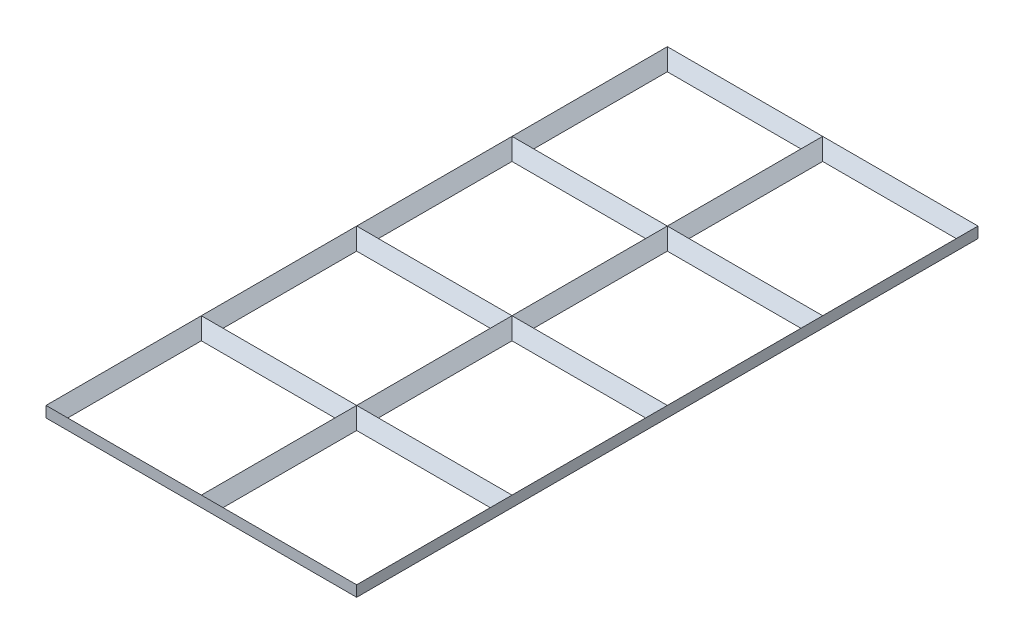
ISO-10303-21;
HEADER;
FILE_DESCRIPTION(('STEP AP214'),'2;1');
FILE_NAME('part.step','',(''),(''),'','','');
FILE_SCHEMA(('AUTOMOTIVE_DESIGN { 1 0 10303 214 1 1 1 1 }'));
ENDSEC;
DATA;
#1=APPLICATION_CONTEXT('core data for automotive mechanical design processes');
#2=APPLICATION_PROTOCOL_DEFINITION('international standard','automotive_design',2000,#1);
#3=PRODUCT_CONTEXT('',#1,'mechanical');
#4=PRODUCT('Part','Part','',(#3));
#5=PRODUCT_RELATED_PRODUCT_CATEGORY('part','',(#4));
#6=PRODUCT_DEFINITION_FORMATION('','',#4);
#7=PRODUCT_DEFINITION_CONTEXT('part definition',#1,'design');
#8=PRODUCT_DEFINITION('design','',#6,#7);
#9=PRODUCT_DEFINITION_SHAPE('','',#8);
#10=(LENGTH_UNIT() NAMED_UNIT(*) SI_UNIT(.MILLI.,.METRE.));
#11=(NAMED_UNIT(*) PLANE_ANGLE_UNIT() SI_UNIT($,.RADIAN.));
#12=(NAMED_UNIT(*) SI_UNIT($,.STERADIAN.) SOLID_ANGLE_UNIT());
#13=UNCERTAINTY_MEASURE_WITH_UNIT(LENGTH_MEASURE(1.E-05),#10,'distance_accuracy_value','');
#14=(GEOMETRIC_REPRESENTATION_CONTEXT(3) GLOBAL_UNCERTAINTY_ASSIGNED_CONTEXT((#13)) GLOBAL_UNIT_ASSIGNED_CONTEXT((#10,
#11,#12)) REPRESENTATION_CONTEXT('',''));
#15=CARTESIAN_POINT('',(0.,0.,0.));
#16=DIRECTION('',(0.,0.,1.));
#17=DIRECTION('',(1.,0.,0.));
#18=AXIS2_PLACEMENT_3D('',#15,#16,#17);
#19=CARTESIAN_POINT('',(0.,3.5,-50.));
#20=DIRECTION('',(0.,0.,-1.));
#21=DIRECTION('',(-1.,0.,0.));
#22=AXIS2_PLACEMENT_3D('',#19,#20,#21);
#23=PLANE('',#22);
#24=DIRECTION('',(1.,0.,0.));
#25=VECTOR('',#24,1.);
#26=CARTESIAN_POINT('',(0.,0.,-50.));
#27=LINE('',#26,#25);
#28=CARTESIAN_POINT('',(0.,0.,-50.));
#29=VERTEX_POINT('',#28);
#30=CARTESIAN_POINT('',(100.,0.,-50.));
#31=VERTEX_POINT('',#30);
#32=EDGE_CURVE('E448',#29,#31,#27,.T.);
#33=ORIENTED_EDGE('',*,*,#32,.F.);
#34=DIRECTION('',(0.,-1.,0.));
#35=VECTOR('',#34,1.);
#36=CARTESIAN_POINT('',(0.,3.5,-50.));
#37=LINE('',#36,#35);
#38=CARTESIAN_POINT('',(0.,3.5,-50.));
#39=VERTEX_POINT('',#38);
#40=EDGE_CURVE('E11',#39,#29,#37,.T.);
#41=ORIENTED_EDGE('',*,*,#40,.F.);
#42=DIRECTION('',(1.,0.,0.));
#43=VECTOR('',#42,1.);
#44=CARTESIAN_POINT('',(0.,3.5,-50.));
#45=LINE('',#44,#43);
#46=CARTESIAN_POINT('',(50.,3.5,-50.));
#47=VERTEX_POINT('',#46);
#48=EDGE_CURVE('E56',#39,#47,#45,.T.);
#49=ORIENTED_EDGE('',*,*,#48,.T.);
#50=DIRECTION('',(1.,0.,0.));
#51=VECTOR('',#50,1.);
#52=CARTESIAN_POINT('',(50.,3.5,-50.));
#53=LINE('',#52,#51);
#54=CARTESIAN_POINT('',(100.,3.5,-50.));
#55=VERTEX_POINT('',#54);
#56=EDGE_CURVE('E328',#47,#55,#53,.T.);
#57=ORIENTED_EDGE('',*,*,#56,.T.);
#58=DIRECTION('',(0.,-1.,0.));
#59=VECTOR('',#58,1.);
#60=CARTESIAN_POINT('',(100.,3.5,-50.));
#61=LINE('',#60,#59);
#62=EDGE_CURVE('E334',#55,#31,#61,.T.);
#63=ORIENTED_EDGE('',*,*,#62,.T.);
#64=EDGE_LOOP('',(#33,#41,#49,#57,#63));
#65=FACE_BOUND('',#64,.T.);
#66=ADVANCED_FACE('F41',(#65),#23,.T.);
#67=CARTESIAN_POINT('',(0.,3.5,0.));
#68=DIRECTION('',(-1.,0.,0.));
#69=DIRECTION('',(0.,0.,1.));
#70=AXIS2_PLACEMENT_3D('',#67,#68,#69);
#71=PLANE('',#70);
#72=DIRECTION('',(0.,0.,-1.));
#73=VECTOR('',#72,1.);
#74=CARTESIAN_POINT('',(0.,0.,0.));
#75=LINE('',#74,#73);
#76=CARTESIAN_POINT('',(0.,0.,150.));
#77=VERTEX_POINT('',#76);
#78=EDGE_CURVE('E457',#77,#29,#75,.T.);
#79=ORIENTED_EDGE('',*,*,#78,.F.);
#80=DIRECTION('',(0.,-1.,0.));
#81=VECTOR('',#80,1.);
#82=CARTESIAN_POINT('',(0.,3.5,150.));
#83=LINE('',#82,#81);
#84=CARTESIAN_POINT('',(0.,3.5,150.));
#85=VERTEX_POINT('',#84);
#86=EDGE_CURVE('E286',#85,#77,#83,.T.);
#87=ORIENTED_EDGE('',*,*,#86,.F.);
#88=DIRECTION('',(0.,0.,-1.));
#89=VECTOR('',#88,1.);
#90=CARTESIAN_POINT('',(0.,3.5,150.));
#91=LINE('',#90,#89);
#92=CARTESIAN_POINT('',(0.,3.5,100.));
#93=VERTEX_POINT('',#92);
#94=EDGE_CURVE('E253',#85,#93,#91,.T.);
#95=ORIENTED_EDGE('',*,*,#94,.T.);
#96=DIRECTION('',(0.,0.,-1.));
#97=VECTOR('',#96,1.);
#98=CARTESIAN_POINT('',(0.,3.5,100.));
#99=LINE('',#98,#97);
#100=CARTESIAN_POINT('',(0.,3.5,50.));
#101=VERTEX_POINT('',#100);
#102=EDGE_CURVE('E238',#93,#101,#99,.T.);
#103=ORIENTED_EDGE('',*,*,#102,.T.);
#104=DIRECTION('',(0.,0.,-1.));
#105=VECTOR('',#104,1.);
#106=CARTESIAN_POINT('',(0.,3.5,50.));
#107=LINE('',#106,#105);
#108=CARTESIAN_POINT('',(0.,3.5,0.));
#109=VERTEX_POINT('',#108);
#110=EDGE_CURVE('E229',#101,#109,#107,.T.);
#111=ORIENTED_EDGE('',*,*,#110,.T.);
#112=DIRECTION('',(0.,0.,-1.));
#113=VECTOR('',#112,1.);
#114=CARTESIAN_POINT('',(0.,3.5,0.));
#115=LINE('',#114,#113);
#116=EDGE_CURVE('E49',#109,#39,#115,.T.);
#117=ORIENTED_EDGE('',*,*,#116,.T.);
#118=ORIENTED_EDGE('',*,*,#40,.T.);
#119=EDGE_LOOP('',(#79,#87,#95,#103,#111,#117,#118));
#120=FACE_BOUND('',#119,.T.);
#121=ADVANCED_FACE('F489',(#120),#71,.T.);
#122=CARTESIAN_POINT('',(0.,0.,0.));
#123=DIRECTION('',(0.,1.,0.));
#124=DIRECTION('',(0.,0.,1.));
#125=AXIS2_PLACEMENT_3D('',#122,#123,#124);
#126=PLANE('',#125);
#127=DIRECTION('',(1.,0.,0.));
#128=VECTOR('',#127,1.);
#129=CARTESIAN_POINT('',(50.,0.,150.));
#130=LINE('',#129,#128);
#131=CARTESIAN_POINT('',(100.,0.,150.));
#132=VERTEX_POINT('',#131);
#133=EDGE_CURVE('E409',#77,#132,#130,.T.);
#134=ORIENTED_EDGE('',*,*,#133,.F.);
#135=ORIENTED_EDGE('',*,*,#78,.T.);
#136=ORIENTED_EDGE('',*,*,#32,.T.);
#137=DIRECTION('',(0.,0.,1.));
#138=VECTOR('',#137,1.);
#139=CARTESIAN_POINT('',(100.,0.,150.));
#140=LINE('',#139,#138);
#141=EDGE_CURVE('E431',#31,#132,#140,.T.);
#142=ORIENTED_EDGE('',*,*,#141,.T.);
#143=EDGE_LOOP('',(#134,#135,#136,#142));
#144=FACE_BOUND('',#143,.T.);
#145=DIRECTION('',(1.,0.,0.));
#146=VECTOR('',#145,1.);
#147=CARTESIAN_POINT('',(0.,0.,-3.5));
#148=LINE('',#147,#146);
#149=CARTESIAN_POINT('',(3.5,0.,-3.5));
#150=VERTEX_POINT('',#149);
#151=CARTESIAN_POINT('',(46.5,0.,-3.5));
#152=VERTEX_POINT('',#151);
#153=EDGE_CURVE('E460',#150,#152,#148,.T.);
#154=ORIENTED_EDGE('',*,*,#153,.T.);
#155=DIRECTION('',(0.,0.,1.));
#156=VECTOR('',#155,1.);
#157=CARTESIAN_POINT('',(46.5,0.,0.));
#158=LINE('',#157,#156);
#159=CARTESIAN_POINT('',(46.5,0.,-46.5));
#160=VERTEX_POINT('',#159);
#161=EDGE_CURVE('E454',#160,#152,#158,.T.);
#162=ORIENTED_EDGE('',*,*,#161,.F.);
#163=DIRECTION('',(1.,0.,0.));
#164=VECTOR('',#163,1.);
#165=CARTESIAN_POINT('',(0.,0.,-46.5));
#166=LINE('',#165,#164);
#167=CARTESIAN_POINT('',(3.5,0.,-46.5));
#168=VERTEX_POINT('',#167);
#169=EDGE_CURVE('E466',#168,#160,#166,.T.);
#170=ORIENTED_EDGE('',*,*,#169,.F.);
#171=DIRECTION('',(0.,0.,-1.));
#172=VECTOR('',#171,1.);
#173=CARTESIAN_POINT('',(3.5,0.,0.));
#174=LINE('',#173,#172);
#175=EDGE_CURVE('E463',#150,#168,#174,.T.);
#176=ORIENTED_EDGE('',*,*,#175,.F.);
#177=EDGE_LOOP('',(#154,#162,#170,#176));
#178=FACE_BOUND('',#177,.T.);
#179=DIRECTION('',(1.,0.,0.));
#180=VECTOR('',#179,1.);
#181=CARTESIAN_POINT('',(50.,0.,146.5));
#182=LINE('',#181,#180);
#183=CARTESIAN_POINT('',(53.5,0.,146.5));
#184=VERTEX_POINT('',#183);
#185=CARTESIAN_POINT('',(96.5,0.,146.5));
#186=VERTEX_POINT('',#185);
#187=EDGE_CURVE('E434',#184,#186,#182,.T.);
#188=ORIENTED_EDGE('',*,*,#187,.T.);
#189=DIRECTION('',(0.,0.,1.));
#190=VECTOR('',#189,1.);
#191=CARTESIAN_POINT('',(96.5,0.,150.));
#192=LINE('',#191,#190);
#193=CARTESIAN_POINT('',(96.5,0.,103.5));
#194=VERTEX_POINT('',#193);
#195=EDGE_CURVE('E419',#194,#186,#192,.T.);
#196=ORIENTED_EDGE('',*,*,#195,.F.);
#197=DIRECTION('',(1.,0.,0.));
#198=VECTOR('',#197,1.);
#199=CARTESIAN_POINT('',(50.,0.,103.5));
#200=LINE('',#199,#198);
#201=CARTESIAN_POINT('',(53.5,0.,103.5));
#202=VERTEX_POINT('',#201);
#203=EDGE_CURVE('E440',#202,#194,#200,.T.);
#204=ORIENTED_EDGE('',*,*,#203,.F.);
#205=DIRECTION('',(0.,0.,-1.));
#206=VECTOR('',#205,1.);
#207=CARTESIAN_POINT('',(53.5,0.,150.));
#208=LINE('',#207,#206);
#209=EDGE_CURVE('E437',#184,#202,#208,.T.);
#210=ORIENTED_EDGE('',*,*,#209,.F.);
#211=EDGE_LOOP('',(#188,#196,#204,#210));
#212=FACE_BOUND('',#211,.T.);
#213=DIRECTION('',(1.,0.,0.));
#214=VECTOR('',#213,1.);
#215=CARTESIAN_POINT('',(50.,0.,96.5));
#216=LINE('',#215,#214);
#217=CARTESIAN_POINT('',(53.5,0.,96.5));
#218=VERTEX_POINT('',#217);
#219=CARTESIAN_POINT('',(96.5,0.,96.5));
#220=VERTEX_POINT('',#219);
#221=EDGE_CURVE('E380',#218,#220,#216,.T.);
#222=ORIENTED_EDGE('',*,*,#221,.T.);
#223=DIRECTION('',(0.,0.,1.));
#224=VECTOR('',#223,1.);
#225=CARTESIAN_POINT('',(96.5,0.,100.));
#226=LINE('',#225,#224);
#227=CARTESIAN_POINT('',(96.5,0.,53.5));
#228=VERTEX_POINT('',#227);
#229=EDGE_CURVE('E391',#228,#220,#226,.T.);
#230=ORIENTED_EDGE('',*,*,#229,.F.);
#231=DIRECTION('',(1.,0.,0.));
#232=VECTOR('',#231,1.);
#233=CARTESIAN_POINT('',(50.,0.,53.5));
#234=LINE('',#233,#232);
#235=CARTESIAN_POINT('',(53.5,0.,53.5));
#236=VERTEX_POINT('',#235);
#237=EDGE_CURVE('E402',#236,#228,#234,.T.);
#238=ORIENTED_EDGE('',*,*,#237,.F.);
#239=DIRECTION('',(0.,0.,-1.));
#240=VECTOR('',#239,1.);
#241=CARTESIAN_POINT('',(53.5,0.,100.));
#242=LINE('',#241,#240);
#243=EDGE_CURVE('E399',#218,#236,#242,.T.);
#244=ORIENTED_EDGE('',*,*,#243,.F.);
#245=EDGE_LOOP('',(#222,#230,#238,#244));
#246=FACE_BOUND('',#245,.T.);
#247=DIRECTION('',(1.,0.,0.));
#248=VECTOR('',#247,1.);
#249=CARTESIAN_POINT('',(50.,0.,46.5));
#250=LINE('',#249,#248);
#251=CARTESIAN_POINT('',(53.5,0.,46.5));
#252=VERTEX_POINT('',#251);
#253=CARTESIAN_POINT('',(96.5,0.,46.5));
#254=VERTEX_POINT('',#253);
#255=EDGE_CURVE('E350',#252,#254,#250,.T.);
#256=ORIENTED_EDGE('',*,*,#255,.T.);
#257=DIRECTION('',(0.,0.,1.));
#258=VECTOR('',#257,1.);
#259=CARTESIAN_POINT('',(96.5,0.,50.));
#260=LINE('',#259,#258);
#261=CARTESIAN_POINT('',(96.5,0.,3.5));
#262=VERTEX_POINT('',#261);
#263=EDGE_CURVE('E361',#262,#254,#260,.T.);
#264=ORIENTED_EDGE('',*,*,#263,.F.);
#265=DIRECTION('',(1.,0.,0.));
#266=VECTOR('',#265,1.);
#267=CARTESIAN_POINT('',(50.,0.,3.5));
#268=LINE('',#267,#266);
#269=CARTESIAN_POINT('',(53.5,0.,3.5));
#270=VERTEX_POINT('',#269);
#271=EDGE_CURVE('E373',#270,#262,#268,.T.);
#272=ORIENTED_EDGE('',*,*,#271,.F.);
#273=DIRECTION('',(0.,0.,-1.));
#274=VECTOR('',#273,1.);
#275=CARTESIAN_POINT('',(53.5,0.,50.));
#276=LINE('',#275,#274);
#277=EDGE_CURVE('E370',#252,#270,#276,.T.);
#278=ORIENTED_EDGE('',*,*,#277,.F.);
#279=EDGE_LOOP('',(#256,#264,#272,#278));
#280=FACE_BOUND('',#279,.T.);
#281=DIRECTION('',(1.,0.,0.));
#282=VECTOR('',#281,1.);
#283=CARTESIAN_POINT('',(50.,0.,-3.5));
#284=LINE('',#283,#282);
#285=CARTESIAN_POINT('',(53.5,0.,-3.5));
#286=VERTEX_POINT('',#285);
#287=CARTESIAN_POINT('',(96.5,0.,-3.5));
#288=VERTEX_POINT('',#287);
#289=EDGE_CURVE('E318',#286,#288,#284,.T.);
#290=ORIENTED_EDGE('',*,*,#289,.T.);
#291=DIRECTION('',(0.,0.,1.));
#292=VECTOR('',#291,1.);
#293=CARTESIAN_POINT('',(96.5,0.,0.));
#294=LINE('',#293,#292);
#295=CARTESIAN_POINT('',(96.5,0.,-46.5));
#296=VERTEX_POINT('',#295);
#297=EDGE_CURVE('E329',#296,#288,#294,.T.);
#298=ORIENTED_EDGE('',*,*,#297,.F.);
#299=DIRECTION('',(1.,0.,0.));
#300=VECTOR('',#299,1.);
#301=CARTESIAN_POINT('',(50.,0.,-46.5));
#302=LINE('',#301,#300);
#303=CARTESIAN_POINT('',(53.5,0.,-46.5));
#304=VERTEX_POINT('',#303);
#305=EDGE_CURVE('E340',#304,#296,#302,.T.);
#306=ORIENTED_EDGE('',*,*,#305,.F.);
#307=DIRECTION('',(0.,0.,-1.));
#308=VECTOR('',#307,1.);
#309=CARTESIAN_POINT('',(53.5,0.,0.));
#310=LINE('',#309,#308);
#311=EDGE_CURVE('E337',#286,#304,#310,.T.);
#312=ORIENTED_EDGE('',*,*,#311,.F.);
#313=EDGE_LOOP('',(#290,#298,#306,#312));
#314=FACE_BOUND('',#313,.T.);
#315=DIRECTION('',(1.,0.,0.));
#316=VECTOR('',#315,1.);
#317=CARTESIAN_POINT('',(0.,0.,96.5));
#318=LINE('',#317,#316);
#319=CARTESIAN_POINT('',(3.5,0.,96.5));
#320=VERTEX_POINT('',#319);
#321=CARTESIAN_POINT('',(46.5,0.,96.5));
#322=VERTEX_POINT('',#321);
#323=EDGE_CURVE('E216',#320,#322,#318,.T.);
#324=ORIENTED_EDGE('',*,*,#323,.T.);
#325=DIRECTION('',(0.,0.,1.));
#326=VECTOR('',#325,1.);
#327=CARTESIAN_POINT('',(46.5,0.,100.));
#328=LINE('',#327,#326);
#329=CARTESIAN_POINT('',(46.5,0.,53.5));
#330=VERTEX_POINT('',#329);
#331=EDGE_CURVE('E262',#330,#322,#328,.T.);
#332=ORIENTED_EDGE('',*,*,#331,.F.);
#333=DIRECTION('',(1.,0.,0.));
#334=VECTOR('',#333,1.);
#335=CARTESIAN_POINT('',(0.,0.,53.5));
#336=LINE('',#335,#334);
#337=CARTESIAN_POINT('',(3.5,0.,53.5));
#338=VERTEX_POINT('',#337);
#339=EDGE_CURVE('E245',#338,#330,#336,.T.);
#340=ORIENTED_EDGE('',*,*,#339,.F.);
#341=DIRECTION('',(0.,0.,-1.));
#342=VECTOR('',#341,1.);
#343=CARTESIAN_POINT('',(3.5,0.,100.));
#344=LINE('',#343,#342);
#345=EDGE_CURVE('E235',#320,#338,#344,.T.);
#346=ORIENTED_EDGE('',*,*,#345,.F.);
#347=EDGE_LOOP('',(#324,#332,#340,#346));
#348=FACE_BOUND('',#347,.T.);
#349=DIRECTION('',(1.,0.,0.));
#350=VECTOR('',#349,1.);
#351=CARTESIAN_POINT('',(0.,0.,46.5));
#352=LINE('',#351,#350);
#353=CARTESIAN_POINT('',(3.5,0.,46.5));
#354=VERTEX_POINT('',#353);
#355=CARTESIAN_POINT('',(46.5,0.,46.5));
#356=VERTEX_POINT('',#355);
#357=EDGE_CURVE('E228',#354,#356,#352,.T.);
#358=ORIENTED_EDGE('',*,*,#357,.T.);
#359=DIRECTION('',(0.,0.,1.));
#360=VECTOR('',#359,1.);
#361=CARTESIAN_POINT('',(46.5,0.,50.));
#362=LINE('',#361,#360);
#363=CARTESIAN_POINT('',(46.5,0.,3.5));
#364=VERTEX_POINT('',#363);
#365=EDGE_CURVE('E265',#364,#356,#362,.T.);
#366=ORIENTED_EDGE('',*,*,#365,.F.);
#367=DIRECTION('',(1.,0.,0.));
#368=VECTOR('',#367,1.);
#369=CARTESIAN_POINT('',(0.,0.,3.5));
#370=LINE('',#369,#368);
#371=CARTESIAN_POINT('',(3.5,0.,3.5));
#372=VERTEX_POINT('',#371);
#373=EDGE_CURVE('E269',#372,#364,#370,.T.);
#374=ORIENTED_EDGE('',*,*,#373,.F.);
#375=DIRECTION('',(0.,0.,-1.));
#376=VECTOR('',#375,1.);
#377=CARTESIAN_POINT('',(3.5,0.,50.));
#378=LINE('',#377,#376);
#379=EDGE_CURVE('E273',#354,#372,#378,.T.);
#380=ORIENTED_EDGE('',*,*,#379,.F.);
#381=EDGE_LOOP('',(#358,#366,#374,#380));
#382=FACE_BOUND('',#381,.T.);
#383=DIRECTION('',(1.,0.,0.));
#384=VECTOR('',#383,1.);
#385=CARTESIAN_POINT('',(0.,0.,146.5));
#386=LINE('',#385,#384);
#387=CARTESIAN_POINT('',(3.5,0.,146.5));
#388=VERTEX_POINT('',#387);
#389=CARTESIAN_POINT('',(46.5,0.,146.5));
#390=VERTEX_POINT('',#389);
#391=EDGE_CURVE('E260',#388,#390,#386,.T.);
#392=ORIENTED_EDGE('',*,*,#391,.T.);
#393=DIRECTION('',(0.,0.,1.));
#394=VECTOR('',#393,1.);
#395=CARTESIAN_POINT('',(46.5,0.,150.));
#396=LINE('',#395,#394);
#397=CARTESIAN_POINT('',(46.5,0.,103.5));
#398=VERTEX_POINT('',#397);
#399=EDGE_CURVE('E291',#398,#390,#396,.T.);
#400=ORIENTED_EDGE('',*,*,#399,.F.);
#401=DIRECTION('',(1.,0.,0.));
#402=VECTOR('',#401,1.);
#403=CARTESIAN_POINT('',(0.,0.,103.5));
#404=LINE('',#403,#402);
#405=CARTESIAN_POINT('',(3.5,0.,103.5));
#406=VERTEX_POINT('',#405);
#407=EDGE_CURVE('E296',#406,#398,#404,.T.);
#408=ORIENTED_EDGE('',*,*,#407,.F.);
#409=DIRECTION('',(0.,0.,-1.));
#410=VECTOR('',#409,1.);
#411=CARTESIAN_POINT('',(3.5,0.,150.));
#412=LINE('',#411,#410);
#413=EDGE_CURVE('E300',#388,#406,#412,.T.);
#414=ORIENTED_EDGE('',*,*,#413,.F.);
#415=EDGE_LOOP('',(#392,#400,#408,#414));
#416=FACE_BOUND('',#415,.T.);
#417=ADVANCED_FACE('F242',(#144,#178,#212,#246,#280,#314,#348,#382,#416),#126,.F.);
#418=CARTESIAN_POINT('',(0.,0.,-3.5));
#419=DIRECTION('',(0.,-0.707106781186549,0.707106781186546));
#420=DIRECTION('',(0.,-0.707106781186546,-0.707106781186549));
#421=AXIS2_PLACEMENT_3D('',#418,#419,#420);
#422=PLANE('',#421);
#423=ORIENTED_EDGE('',*,*,#153,.F.);
#424=DIRECTION('',(-0.577350269189627,0.577350269189624,0.577350269189627));
#425=VECTOR('',#424,1.);
#426=CARTESIAN_POINT('',(2.33333333333333,1.16666666666667,-2.33333333333333));
#427=LINE('',#426,#425);
#428=EDGE_CURVE('E73',#109,#150,#427,.F.);
#429=ORIENTED_EDGE('',*,*,#428,.F.);
#430=DIRECTION('',(1.,0.,0.));
#431=VECTOR('',#430,1.);
#432=CARTESIAN_POINT('',(0.,3.5,0.));
#433=LINE('',#432,#431);
#434=CARTESIAN_POINT('',(50.,3.5,0.));
#435=VERTEX_POINT('',#434);
#436=EDGE_CURVE('E240',#109,#435,#433,.T.);
#437=ORIENTED_EDGE('',*,*,#436,.T.);
#438=DIRECTION('',(0.577350269189627,0.577350269189624,0.577350269189627));
#439=VECTOR('',#438,1.);
#440=CARTESIAN_POINT('',(31.,-15.5,-19.));
#441=LINE('',#440,#439);
#442=EDGE_CURVE('E446',#435,#152,#441,.F.);
#443=ORIENTED_EDGE('',*,*,#442,.T.);
#444=EDGE_LOOP('',(#423,#429,#437,#443));
#445=FACE_BOUND('',#444,.T.);
#446=ADVANCED_FACE('F475',(#445),#422,.F.);
#447=CARTESIAN_POINT('',(46.5,0.,0.));
#448=DIRECTION('',(0.707106781186546,-0.707106781186549,0.));
#449=DIRECTION('',(0.707106781186549,0.707106781186546,0.));
#450=AXIS2_PLACEMENT_3D('',#447,#448,#449);
#451=PLANE('',#450);
#452=ORIENTED_EDGE('',*,*,#161,.T.);
#453=ORIENTED_EDGE('',*,*,#442,.F.);
#454=DIRECTION('',(0.,0.,-1.));
#455=VECTOR('',#454,1.);
#456=CARTESIAN_POINT('',(50.,3.5,0.));
#457=LINE('',#456,#455);
#458=EDGE_CURVE('E332',#435,#47,#457,.T.);
#459=ORIENTED_EDGE('',*,*,#458,.T.);
#460=DIRECTION('',(-0.577350269189626,-0.577350269189624,0.577350269189627));
#461=VECTOR('',#460,1.);
#462=CARTESIAN_POINT('',(31.,-15.5,-31.));
#463=LINE('',#462,#461);
#464=EDGE_CURVE('E78',#47,#160,#463,.T.);
#465=ORIENTED_EDGE('',*,*,#464,.T.);
#466=EDGE_LOOP('',(#452,#453,#459,#465));
#467=FACE_BOUND('',#466,.T.);
#468=ADVANCED_FACE('F470',(#467),#451,.F.);
#469=CARTESIAN_POINT('',(0.,0.,-46.5));
#470=DIRECTION('',(0.,-0.707106781186549,-0.707106781186546));
#471=DIRECTION('',(0.,0.707106781186546,-0.707106781186549));
#472=AXIS2_PLACEMENT_3D('',#469,#470,#471);
#473=PLANE('',#472);
#474=ORIENTED_EDGE('',*,*,#169,.T.);
#475=ORIENTED_EDGE('',*,*,#464,.F.);
#476=ORIENTED_EDGE('',*,*,#48,.F.);
#477=DIRECTION('',(0.577350269189627,-0.577350269189624,0.577350269189627));
#478=VECTOR('',#477,1.);
#479=CARTESIAN_POINT('',(19.,-15.5,-31.));
#480=LINE('',#479,#478);
#481=EDGE_CURVE('E450',#39,#168,#480,.T.);
#482=ORIENTED_EDGE('',*,*,#481,.T.);
#483=EDGE_LOOP('',(#474,#475,#476,#482));
#484=FACE_BOUND('',#483,.T.);
#485=ADVANCED_FACE('F578',(#484),#473,.F.);
#486=CARTESIAN_POINT('',(3.5,0.,0.));
#487=DIRECTION('',(-0.707106781186546,-0.707106781186549,0.));
#488=DIRECTION('',(0.707106781186549,-0.707106781186546,0.));
#489=AXIS2_PLACEMENT_3D('',#486,#487,#488);
#490=PLANE('',#489);
#491=ORIENTED_EDGE('',*,*,#175,.T.);
#492=ORIENTED_EDGE('',*,*,#481,.F.);
#493=ORIENTED_EDGE('',*,*,#116,.F.);
#494=ORIENTED_EDGE('',*,*,#428,.T.);
#495=EDGE_LOOP('',(#491,#492,#493,#494));
#496=FACE_BOUND('',#495,.T.);
#497=ADVANCED_FACE('F477',(#496),#490,.F.);
#498=CARTESIAN_POINT('',(50.,3.5,150.));
#499=DIRECTION('',(0.,0.,-1.));
#500=DIRECTION('',(-1.,0.,0.));
#501=AXIS2_PLACEMENT_3D('',#498,#499,#500);
#502=PLANE('',#501);
#503=ORIENTED_EDGE('',*,*,#133,.T.);
#504=DIRECTION('',(0.,-1.,0.));
#505=VECTOR('',#504,1.);
#506=CARTESIAN_POINT('',(100.,3.5,150.));
#507=LINE('',#506,#505);
#508=CARTESIAN_POINT('',(100.,3.5,150.));
#509=VERTEX_POINT('',#508);
#510=EDGE_CURVE('E428',#509,#132,#507,.T.);
#511=ORIENTED_EDGE('',*,*,#510,.F.);
#512=DIRECTION('',(1.,0.,0.));
#513=VECTOR('',#512,1.);
#514=CARTESIAN_POINT('',(50.,3.5,150.));
#515=LINE('',#514,#513);
#516=CARTESIAN_POINT('',(50.,3.5,150.));
#517=VERTEX_POINT('',#516);
#518=EDGE_CURVE('E416',#517,#509,#515,.T.);
#519=ORIENTED_EDGE('',*,*,#518,.F.);
#520=DIRECTION('',(1.,0.,0.));
#521=VECTOR('',#520,1.);
#522=CARTESIAN_POINT('',(0.,3.5,150.));
#523=LINE('',#522,#521);
#524=EDGE_CURVE('E290',#85,#517,#523,.T.);
#525=ORIENTED_EDGE('',*,*,#524,.F.);
#526=ORIENTED_EDGE('',*,*,#86,.T.);
#527=EDGE_LOOP('',(#503,#511,#519,#525,#526));
#528=FACE_BOUND('',#527,.T.);
#529=ADVANCED_FACE('F583',(#528),#502,.F.);
#530=CARTESIAN_POINT('',(100.,3.5,150.));
#531=DIRECTION('',(1.,0.,0.));
#532=DIRECTION('',(0.,0.,-1.));
#533=AXIS2_PLACEMENT_3D('',#530,#531,#532);
#534=PLANE('',#533);
#535=ORIENTED_EDGE('',*,*,#141,.F.);
#536=ORIENTED_EDGE('',*,*,#62,.F.);
#537=DIRECTION('',(0.,0.,1.));
#538=VECTOR('',#537,1.);
#539=CARTESIAN_POINT('',(100.,3.5,0.));
#540=LINE('',#539,#538);
#541=CARTESIAN_POINT('',(100.,3.5,0.));
#542=VERTEX_POINT('',#541);
#543=EDGE_CURVE('E325',#55,#542,#540,.T.);
#544=ORIENTED_EDGE('',*,*,#543,.T.);
#545=DIRECTION('',(0.,0.,1.));
#546=VECTOR('',#545,1.);
#547=CARTESIAN_POINT('',(100.,3.5,50.));
#548=LINE('',#547,#546);
#549=CARTESIAN_POINT('',(100.,3.5,50.));
#550=VERTEX_POINT('',#549);
#551=EDGE_CURVE('E357',#542,#550,#548,.T.);
#552=ORIENTED_EDGE('',*,*,#551,.T.);
#553=DIRECTION('',(0.,0.,1.));
#554=VECTOR('',#553,1.);
#555=CARTESIAN_POINT('',(100.,3.5,100.));
#556=LINE('',#555,#554);
#557=CARTESIAN_POINT('',(100.,3.5,100.));
#558=VERTEX_POINT('',#557);
#559=EDGE_CURVE('E387',#550,#558,#556,.T.);
#560=ORIENTED_EDGE('',*,*,#559,.T.);
#561=DIRECTION('',(0.,0.,1.));
#562=VECTOR('',#561,1.);
#563=CARTESIAN_POINT('',(100.,3.5,150.));
#564=LINE('',#563,#562);
#565=EDGE_CURVE('E418',#558,#509,#564,.T.);
#566=ORIENTED_EDGE('',*,*,#565,.T.);
#567=ORIENTED_EDGE('',*,*,#510,.T.);
#568=EDGE_LOOP('',(#535,#536,#544,#552,#560,#566,#567));
#569=FACE_BOUND('',#568,.T.);
#570=ADVANCED_FACE('F534',(#569),#534,.T.);
#571=CARTESIAN_POINT('',(50.,0.,146.5));
#572=DIRECTION('',(0.,-0.707106781186549,0.707106781186546));
#573=DIRECTION('',(0.,-0.707106781186546,-0.707106781186549));
#574=AXIS2_PLACEMENT_3D('',#571,#572,#573);
#575=PLANE('',#574);
#576=ORIENTED_EDGE('',*,*,#187,.F.);
#577=DIRECTION('',(-0.577350269189627,0.577350269189624,0.577350269189627));
#578=VECTOR('',#577,1.);
#579=CARTESIAN_POINT('',(52.3333333333333,1.16666666666667,147.666666666667));
#580=LINE('',#579,#578);
#581=EDGE_CURVE('E396',#517,#184,#580,.F.);
#582=ORIENTED_EDGE('',*,*,#581,.F.);
#583=ORIENTED_EDGE('',*,*,#518,.T.);
#584=DIRECTION('',(0.577350269189627,0.577350269189624,0.577350269189627));
#585=VECTOR('',#584,1.);
#586=CARTESIAN_POINT('',(81.,-15.5,131.));
#587=LINE('',#586,#585);
#588=EDGE_CURVE('E407',#509,#186,#587,.F.);
#589=ORIENTED_EDGE('',*,*,#588,.T.);
#590=EDGE_LOOP('',(#576,#582,#583,#589));
#591=FACE_BOUND('',#590,.T.);
#592=ADVANCED_FACE('F591',(#591),#575,.F.);
#593=CARTESIAN_POINT('',(96.5,0.,150.));
#594=DIRECTION('',(0.707106781186546,-0.707106781186549,0.));
#595=DIRECTION('',(0.707106781186549,0.707106781186546,0.));
#596=AXIS2_PLACEMENT_3D('',#593,#594,#595);
#597=PLANE('',#596);
#598=ORIENTED_EDGE('',*,*,#195,.T.);
#599=ORIENTED_EDGE('',*,*,#588,.F.);
#600=ORIENTED_EDGE('',*,*,#565,.F.);
#601=DIRECTION('',(-0.577350269189626,-0.577350269189624,0.577350269189627));
#602=VECTOR('',#601,1.);
#603=CARTESIAN_POINT('',(81.,-15.5,119.));
#604=LINE('',#603,#602);
#605=EDGE_CURVE('E410',#558,#194,#604,.T.);
#606=ORIENTED_EDGE('',*,*,#605,.T.);
#607=EDGE_LOOP('',(#598,#599,#600,#606));
#608=FACE_BOUND('',#607,.T.);
#609=ADVANCED_FACE('F592',(#608),#597,.F.);
#610=CARTESIAN_POINT('',(50.,0.,103.5));
#611=DIRECTION('',(0.,-0.707106781186549,-0.707106781186546));
#612=DIRECTION('',(0.,0.707106781186546,-0.707106781186549));
#613=AXIS2_PLACEMENT_3D('',#610,#611,#612);
#614=PLANE('',#613);
#615=ORIENTED_EDGE('',*,*,#203,.T.);
#616=ORIENTED_EDGE('',*,*,#605,.F.);
#617=DIRECTION('',(1.,0.,0.));
#618=VECTOR('',#617,1.);
#619=CARTESIAN_POINT('',(50.,3.5,100.));
#620=LINE('',#619,#618);
#621=CARTESIAN_POINT('',(50.,3.5,100.));
#622=VERTEX_POINT('',#621);
#623=EDGE_CURVE('E422',#622,#558,#620,.T.);
#624=ORIENTED_EDGE('',*,*,#623,.F.);
#625=DIRECTION('',(0.577350269189627,-0.577350269189624,0.577350269189627));
#626=VECTOR('',#625,1.);
#627=CARTESIAN_POINT('',(69.,-15.5,119.));
#628=LINE('',#627,#626);
#629=EDGE_CURVE('E413',#622,#202,#628,.T.);
#630=ORIENTED_EDGE('',*,*,#629,.T.);
#631=EDGE_LOOP('',(#615,#616,#624,#630));
#632=FACE_BOUND('',#631,.T.);
#633=ADVANCED_FACE('F595',(#632),#614,.F.);
#634=CARTESIAN_POINT('',(53.5,0.,150.));
#635=DIRECTION('',(-0.707106781186546,-0.707106781186549,0.));
#636=DIRECTION('',(0.707106781186549,-0.707106781186546,0.));
#637=AXIS2_PLACEMENT_3D('',#634,#635,#636);
#638=PLANE('',#637);
#639=ORIENTED_EDGE('',*,*,#209,.T.);
#640=ORIENTED_EDGE('',*,*,#629,.F.);
#641=DIRECTION('',(0.,0.,-1.));
#642=VECTOR('',#641,1.);
#643=CARTESIAN_POINT('',(50.,3.5,150.));
#644=LINE('',#643,#642);
#645=EDGE_CURVE('E425',#517,#622,#644,.T.);
#646=ORIENTED_EDGE('',*,*,#645,.F.);
#647=ORIENTED_EDGE('',*,*,#581,.T.);
#648=EDGE_LOOP('',(#639,#640,#646,#647));
#649=FACE_BOUND('',#648,.T.);
#650=ADVANCED_FACE('F599',(#649),#638,.F.);
#651=CARTESIAN_POINT('',(50.,0.,96.5));
#652=DIRECTION('',(0.,-0.707106781186549,0.707106781186546));
#653=DIRECTION('',(0.,-0.707106781186546,-0.707106781186549));
#654=AXIS2_PLACEMENT_3D('',#651,#652,#653);
#655=PLANE('',#654);
#656=ORIENTED_EDGE('',*,*,#221,.F.);
#657=DIRECTION('',(-0.577350269189627,0.577350269189624,0.577350269189627));
#658=VECTOR('',#657,1.);
#659=CARTESIAN_POINT('',(52.3333333333333,1.16666666666667,97.6666666666667));
#660=LINE('',#659,#658);
#661=EDGE_CURVE('E367',#622,#218,#660,.F.);
#662=ORIENTED_EDGE('',*,*,#661,.F.);
#663=ORIENTED_EDGE('',*,*,#623,.T.);
#664=DIRECTION('',(0.577350269189627,0.577350269189624,0.577350269189627));
#665=VECTOR('',#664,1.);
#666=CARTESIAN_POINT('',(81.,-15.5,81.));
#667=LINE('',#666,#665);
#668=EDGE_CURVE('E378',#558,#220,#667,.F.);
#669=ORIENTED_EDGE('',*,*,#668,.T.);
#670=EDGE_LOOP('',(#656,#662,#663,#669));
#671=FACE_BOUND('',#670,.T.);
#672=ADVANCED_FACE('F603',(#671),#655,.F.);
#673=CARTESIAN_POINT('',(96.5,0.,100.));
#674=DIRECTION('',(0.707106781186546,-0.707106781186549,0.));
#675=DIRECTION('',(0.707106781186549,0.707106781186546,0.));
#676=AXIS2_PLACEMENT_3D('',#673,#674,#675);
#677=PLANE('',#676);
#678=ORIENTED_EDGE('',*,*,#229,.T.);
#679=ORIENTED_EDGE('',*,*,#668,.F.);
#680=ORIENTED_EDGE('',*,*,#559,.F.);
#681=DIRECTION('',(-0.577350269189626,-0.577350269189624,0.577350269189627));
#682=VECTOR('',#681,1.);
#683=CARTESIAN_POINT('',(81.,-15.5,69.));
#684=LINE('',#683,#682);
#685=EDGE_CURVE('E381',#550,#228,#684,.T.);
#686=ORIENTED_EDGE('',*,*,#685,.T.);
#687=EDGE_LOOP('',(#678,#679,#680,#686));
#688=FACE_BOUND('',#687,.T.);
#689=ADVANCED_FACE('F608',(#688),#677,.F.);
#690=CARTESIAN_POINT('',(50.,0.,53.5));
#691=DIRECTION('',(0.,-0.707106781186549,-0.707106781186546));
#692=DIRECTION('',(0.,0.707106781186546,-0.707106781186549));
#693=AXIS2_PLACEMENT_3D('',#690,#691,#692);
#694=PLANE('',#693);
#695=ORIENTED_EDGE('',*,*,#237,.T.);
#696=ORIENTED_EDGE('',*,*,#685,.F.);
#697=DIRECTION('',(1.,0.,0.));
#698=VECTOR('',#697,1.);
#699=CARTESIAN_POINT('',(50.,3.5,50.));
#700=LINE('',#699,#698);
#701=CARTESIAN_POINT('',(50.,3.5,50.));
#702=VERTEX_POINT('',#701);
#703=EDGE_CURVE('E390',#702,#550,#700,.T.);
#704=ORIENTED_EDGE('',*,*,#703,.F.);
#705=DIRECTION('',(0.577350269189627,-0.577350269189624,0.577350269189627));
#706=VECTOR('',#705,1.);
#707=CARTESIAN_POINT('',(69.,-15.5,69.));
#708=LINE('',#707,#706);
#709=EDGE_CURVE('E384',#702,#236,#708,.T.);
#710=ORIENTED_EDGE('',*,*,#709,.T.);
#711=EDGE_LOOP('',(#695,#696,#704,#710));
#712=FACE_BOUND('',#711,.T.);
#713=ADVANCED_FACE('F521',(#712),#694,.F.);
#714=CARTESIAN_POINT('',(53.5,0.,100.));
#715=DIRECTION('',(-0.707106781186546,-0.707106781186549,0.));
#716=DIRECTION('',(0.707106781186549,-0.707106781186546,0.));
#717=AXIS2_PLACEMENT_3D('',#714,#715,#716);
#718=PLANE('',#717);
#719=ORIENTED_EDGE('',*,*,#243,.T.);
#720=ORIENTED_EDGE('',*,*,#709,.F.);
#721=DIRECTION('',(0.,0.,-1.));
#722=VECTOR('',#721,1.);
#723=CARTESIAN_POINT('',(50.,3.5,100.));
#724=LINE('',#723,#722);
#725=EDGE_CURVE('E393',#622,#702,#724,.T.);
#726=ORIENTED_EDGE('',*,*,#725,.F.);
#727=ORIENTED_EDGE('',*,*,#661,.T.);
#728=EDGE_LOOP('',(#719,#720,#726,#727));
#729=FACE_BOUND('',#728,.T.);
#730=ADVANCED_FACE('F516',(#729),#718,.F.);
#731=CARTESIAN_POINT('',(50.,0.,46.5));
#732=DIRECTION('',(0.,-0.707106781186549,0.707106781186546));
#733=DIRECTION('',(0.,-0.707106781186546,-0.707106781186549));
#734=AXIS2_PLACEMENT_3D('',#731,#732,#733);
#735=PLANE('',#734);
#736=ORIENTED_EDGE('',*,*,#255,.F.);
#737=DIRECTION('',(-0.577350269189627,0.577350269189624,0.577350269189627));
#738=VECTOR('',#737,1.);
#739=CARTESIAN_POINT('',(52.3333333333333,1.16666666666667,47.6666666666667));
#740=LINE('',#739,#738);
#741=EDGE_CURVE('E347',#702,#252,#740,.F.);
#742=ORIENTED_EDGE('',*,*,#741,.F.);
#743=ORIENTED_EDGE('',*,*,#703,.T.);
#744=DIRECTION('',(0.577350269189627,0.577350269189624,0.577350269189627));
#745=VECTOR('',#744,1.);
#746=CARTESIAN_POINT('',(81.,-15.5,31.));
#747=LINE('',#746,#745);
#748=EDGE_CURVE('E348',#550,#254,#747,.F.);
#749=ORIENTED_EDGE('',*,*,#748,.T.);
#750=EDGE_LOOP('',(#736,#742,#743,#749));
#751=FACE_BOUND('',#750,.T.);
#752=ADVANCED_FACE('F527',(#751),#735,.F.);
#753=CARTESIAN_POINT('',(96.5,0.,50.));
#754=DIRECTION('',(0.707106781186546,-0.707106781186549,0.));
#755=DIRECTION('',(0.707106781186549,0.707106781186546,0.));
#756=AXIS2_PLACEMENT_3D('',#753,#754,#755);
#757=PLANE('',#756);
#758=ORIENTED_EDGE('',*,*,#263,.T.);
#759=ORIENTED_EDGE('',*,*,#748,.F.);
#760=ORIENTED_EDGE('',*,*,#551,.F.);
#761=DIRECTION('',(-0.577350269189626,-0.577350269189624,0.577350269189627));
#762=VECTOR('',#761,1.);
#763=CARTESIAN_POINT('',(81.,-15.5,19.));
#764=LINE('',#763,#762);
#765=EDGE_CURVE('E351',#542,#262,#764,.T.);
#766=ORIENTED_EDGE('',*,*,#765,.T.);
#767=EDGE_LOOP('',(#758,#759,#760,#766));
#768=FACE_BOUND('',#767,.T.);
#769=ADVANCED_FACE('F530',(#768),#757,.F.);
#770=CARTESIAN_POINT('',(50.,0.,3.5));
#771=DIRECTION('',(0.,-0.707106781186549,-0.707106781186546));
#772=DIRECTION('',(0.,0.707106781186546,-0.707106781186549));
#773=AXIS2_PLACEMENT_3D('',#770,#771,#772);
#774=PLANE('',#773);
#775=ORIENTED_EDGE('',*,*,#271,.T.);
#776=ORIENTED_EDGE('',*,*,#765,.F.);
#777=DIRECTION('',(1.,0.,0.));
#778=VECTOR('',#777,1.);
#779=CARTESIAN_POINT('',(50.,3.5,0.));
#780=LINE('',#779,#778);
#781=EDGE_CURVE('E360',#435,#542,#780,.T.);
#782=ORIENTED_EDGE('',*,*,#781,.F.);
#783=DIRECTION('',(0.577350269189627,-0.577350269189624,0.577350269189627));
#784=VECTOR('',#783,1.);
#785=CARTESIAN_POINT('',(69.,-15.5,19.));
#786=LINE('',#785,#784);
#787=EDGE_CURVE('E354',#435,#270,#786,.T.);
#788=ORIENTED_EDGE('',*,*,#787,.T.);
#789=EDGE_LOOP('',(#775,#776,#782,#788));
#790=FACE_BOUND('',#789,.T.);
#791=ADVANCED_FACE('F545',(#790),#774,.F.);
#792=CARTESIAN_POINT('',(53.5,0.,50.));
#793=DIRECTION('',(-0.707106781186546,-0.707106781186549,0.));
#794=DIRECTION('',(0.707106781186549,-0.707106781186546,0.));
#795=AXIS2_PLACEMENT_3D('',#792,#793,#794);
#796=PLANE('',#795);
#797=ORIENTED_EDGE('',*,*,#277,.T.);
#798=ORIENTED_EDGE('',*,*,#787,.F.);
#799=DIRECTION('',(0.,0.,-1.));
#800=VECTOR('',#799,1.);
#801=CARTESIAN_POINT('',(50.,3.5,50.));
#802=LINE('',#801,#800);
#803=EDGE_CURVE('E364',#702,#435,#802,.T.);
#804=ORIENTED_EDGE('',*,*,#803,.F.);
#805=ORIENTED_EDGE('',*,*,#741,.T.);
#806=EDGE_LOOP('',(#797,#798,#804,#805));
#807=FACE_BOUND('',#806,.T.);
#808=ADVANCED_FACE('F505',(#807),#796,.F.);
#809=CARTESIAN_POINT('',(50.,0.,-3.5));
#810=DIRECTION('',(0.,-0.707106781186549,0.707106781186546));
#811=DIRECTION('',(0.,-0.707106781186546,-0.707106781186549));
#812=AXIS2_PLACEMENT_3D('',#809,#810,#811);
#813=PLANE('',#812);
#814=ORIENTED_EDGE('',*,*,#289,.F.);
#815=DIRECTION('',(-0.577350269189627,0.577350269189624,0.577350269189627));
#816=VECTOR('',#815,1.);
#817=CARTESIAN_POINT('',(52.3333333333333,1.16666666666667,-2.33333333333333));
#818=LINE('',#817,#816);
#819=EDGE_CURVE('E314',#435,#286,#818,.F.);
#820=ORIENTED_EDGE('',*,*,#819,.F.);
#821=ORIENTED_EDGE('',*,*,#781,.T.);
#822=DIRECTION('',(0.577350269189627,0.577350269189624,0.577350269189627));
#823=VECTOR('',#822,1.);
#824=CARTESIAN_POINT('',(81.,-15.5,-19.));
#825=LINE('',#824,#823);
#826=EDGE_CURVE('E316',#542,#288,#825,.F.);
#827=ORIENTED_EDGE('',*,*,#826,.T.);
#828=EDGE_LOOP('',(#814,#820,#821,#827));
#829=FACE_BOUND('',#828,.T.);
#830=ADVANCED_FACE('F542',(#829),#813,.F.);
#831=CARTESIAN_POINT('',(96.5,0.,0.));
#832=DIRECTION('',(0.707106781186546,-0.707106781186549,0.));
#833=DIRECTION('',(0.707106781186549,0.707106781186546,0.));
#834=AXIS2_PLACEMENT_3D('',#831,#832,#833);
#835=PLANE('',#834);
#836=ORIENTED_EDGE('',*,*,#297,.T.);
#837=ORIENTED_EDGE('',*,*,#826,.F.);
#838=ORIENTED_EDGE('',*,*,#543,.F.);
#839=DIRECTION('',(-0.577350269189626,-0.577350269189624,0.577350269189627));
#840=VECTOR('',#839,1.);
#841=CARTESIAN_POINT('',(81.,-15.5,-31.));
#842=LINE('',#841,#840);
#843=EDGE_CURVE('E319',#55,#296,#842,.T.);
#844=ORIENTED_EDGE('',*,*,#843,.T.);
#845=EDGE_LOOP('',(#836,#837,#838,#844));
#846=FACE_BOUND('',#845,.T.);
#847=ADVANCED_FACE('F539',(#846),#835,.F.);
#848=CARTESIAN_POINT('',(50.,0.,-46.5));
#849=DIRECTION('',(0.,-0.707106781186549,-0.707106781186546));
#850=DIRECTION('',(0.,0.707106781186546,-0.707106781186549));
#851=AXIS2_PLACEMENT_3D('',#848,#849,#850);
#852=PLANE('',#851);
#853=ORIENTED_EDGE('',*,*,#305,.T.);
#854=ORIENTED_EDGE('',*,*,#843,.F.);
#855=ORIENTED_EDGE('',*,*,#56,.F.);
#856=DIRECTION('',(0.577350269189627,-0.577350269189624,0.577350269189627));
#857=VECTOR('',#856,1.);
#858=CARTESIAN_POINT('',(69.,-15.5,-31.));
#859=LINE('',#858,#857);
#860=EDGE_CURVE('E322',#47,#304,#859,.T.);
#861=ORIENTED_EDGE('',*,*,#860,.T.);
#862=EDGE_LOOP('',(#853,#854,#855,#861));
#863=FACE_BOUND('',#862,.T.);
#864=ADVANCED_FACE('F560',(#863),#852,.F.);
#865=CARTESIAN_POINT('',(53.5,0.,0.));
#866=DIRECTION('',(-0.707106781186546,-0.707106781186549,0.));
#867=DIRECTION('',(0.707106781186549,-0.707106781186546,0.));
#868=AXIS2_PLACEMENT_3D('',#865,#866,#867);
#869=PLANE('',#868);
#870=ORIENTED_EDGE('',*,*,#311,.T.);
#871=ORIENTED_EDGE('',*,*,#860,.F.);
#872=ORIENTED_EDGE('',*,*,#458,.F.);
#873=ORIENTED_EDGE('',*,*,#819,.T.);
#874=EDGE_LOOP('',(#870,#871,#872,#873));
#875=FACE_BOUND('',#874,.T.);
#876=ADVANCED_FACE('F556',(#875),#869,.F.);
#877=CARTESIAN_POINT('',(0.,0.,96.5));
#878=DIRECTION('',(0.,-0.707106781186549,0.707106781186546));
#879=DIRECTION('',(0.,-0.707106781186546,-0.707106781186549));
#880=AXIS2_PLACEMENT_3D('',#877,#878,#879);
#881=PLANE('',#880);
#882=ORIENTED_EDGE('',*,*,#323,.F.);
#883=DIRECTION('',(-0.577350269189627,0.577350269189624,0.577350269189627));
#884=VECTOR('',#883,1.);
#885=CARTESIAN_POINT('',(2.33333333333333,1.16666666666667,97.6666666666667));
#886=LINE('',#885,#884);
#887=EDGE_CURVE('E220',#93,#320,#886,.F.);
#888=ORIENTED_EDGE('',*,*,#887,.F.);
#889=DIRECTION('',(1.,0.,0.));
#890=VECTOR('',#889,1.);
#891=CARTESIAN_POINT('',(0.,3.5,100.));
#892=LINE('',#891,#890);
#893=EDGE_CURVE('E258',#93,#622,#892,.T.);
#894=ORIENTED_EDGE('',*,*,#893,.T.);
#895=DIRECTION('',(0.577350269189627,0.577350269189624,0.577350269189627));
#896=VECTOR('',#895,1.);
#897=CARTESIAN_POINT('',(31.,-15.5,81.));
#898=LINE('',#897,#896);
#899=EDGE_CURVE('E223',#622,#322,#898,.F.);
#900=ORIENTED_EDGE('',*,*,#899,.T.);
#901=EDGE_LOOP('',(#882,#888,#894,#900));
#902=FACE_BOUND('',#901,.T.);
#903=ADVANCED_FACE('F218',(#902),#881,.F.);
#904=CARTESIAN_POINT('',(46.5,0.,100.));
#905=DIRECTION('',(0.707106781186546,-0.707106781186549,0.));
#906=DIRECTION('',(0.707106781186549,0.707106781186546,0.));
#907=AXIS2_PLACEMENT_3D('',#904,#905,#906);
#908=PLANE('',#907);
#909=ORIENTED_EDGE('',*,*,#331,.T.);
#910=ORIENTED_EDGE('',*,*,#899,.F.);
#911=ORIENTED_EDGE('',*,*,#725,.T.);
#912=DIRECTION('',(-0.577350269189626,-0.577350269189624,0.577350269189627));
#913=VECTOR('',#912,1.);
#914=CARTESIAN_POINT('',(31.,-15.5,69.));
#915=LINE('',#914,#913);
#916=EDGE_CURVE('E261',#702,#330,#915,.T.);
#917=ORIENTED_EDGE('',*,*,#916,.T.);
#918=EDGE_LOOP('',(#909,#910,#911,#917));
#919=FACE_BOUND('',#918,.T.);
#920=ADVANCED_FACE('F512',(#919),#908,.F.);
#921=CARTESIAN_POINT('',(0.,0.,53.5));
#922=DIRECTION('',(0.,-0.707106781186549,-0.707106781186546));
#923=DIRECTION('',(0.,0.707106781186546,-0.707106781186549));
#924=AXIS2_PLACEMENT_3D('',#921,#922,#923);
#925=PLANE('',#924);
#926=ORIENTED_EDGE('',*,*,#339,.T.);
#927=ORIENTED_EDGE('',*,*,#916,.F.);
#928=DIRECTION('',(1.,0.,0.));
#929=VECTOR('',#928,1.);
#930=CARTESIAN_POINT('',(0.,3.5,50.));
#931=LINE('',#930,#929);
#932=EDGE_CURVE('E254',#101,#702,#931,.T.);
#933=ORIENTED_EDGE('',*,*,#932,.F.);
#934=DIRECTION('',(0.577350269189627,-0.577350269189624,0.577350269189627));
#935=VECTOR('',#934,1.);
#936=CARTESIAN_POINT('',(19.,-15.5,69.));
#937=LINE('',#936,#935);
#938=EDGE_CURVE('E246',#101,#338,#937,.T.);
#939=ORIENTED_EDGE('',*,*,#938,.T.);
#940=EDGE_LOOP('',(#926,#927,#933,#939));
#941=FACE_BOUND('',#940,.T.);
#942=ADVANCED_FACE('F509',(#941),#925,.F.);
#943=CARTESIAN_POINT('',(3.5,0.,100.));
#944=DIRECTION('',(-0.707106781186546,-0.707106781186549,0.));
#945=DIRECTION('',(0.707106781186549,-0.707106781186546,0.));
#946=AXIS2_PLACEMENT_3D('',#943,#944,#945);
#947=PLANE('',#946);
#948=ORIENTED_EDGE('',*,*,#345,.T.);
#949=ORIENTED_EDGE('',*,*,#938,.F.);
#950=ORIENTED_EDGE('',*,*,#102,.F.);
#951=ORIENTED_EDGE('',*,*,#887,.T.);
#952=EDGE_LOOP('',(#948,#949,#950,#951));
#953=FACE_BOUND('',#952,.T.);
#954=ADVANCED_FACE('F233',(#953),#947,.F.);
#955=CARTESIAN_POINT('',(0.,0.,46.5));
#956=DIRECTION('',(0.,-0.707106781186549,0.707106781186546));
#957=DIRECTION('',(0.,-0.707106781186546,-0.707106781186549));
#958=AXIS2_PLACEMENT_3D('',#955,#956,#957);
#959=PLANE('',#958);
#960=ORIENTED_EDGE('',*,*,#357,.F.);
#961=DIRECTION('',(-0.577350269189627,0.577350269189624,0.577350269189627));
#962=VECTOR('',#961,1.);
#963=CARTESIAN_POINT('',(2.33333333333333,1.16666666666667,47.6666666666667));
#964=LINE('',#963,#962);
#965=EDGE_CURVE('E276',#101,#354,#964,.F.);
#966=ORIENTED_EDGE('',*,*,#965,.F.);
#967=ORIENTED_EDGE('',*,*,#932,.T.);
#968=DIRECTION('',(0.577350269189627,0.577350269189624,0.577350269189627));
#969=VECTOR('',#968,1.);
#970=CARTESIAN_POINT('',(31.,-15.5,31.));
#971=LINE('',#970,#969);
#972=EDGE_CURVE('E257',#702,#356,#971,.F.);
#973=ORIENTED_EDGE('',*,*,#972,.T.);
#974=EDGE_LOOP('',(#960,#966,#967,#973));
#975=FACE_BOUND('',#974,.T.);
#976=ADVANCED_FACE('F494',(#975),#959,.F.);
#977=CARTESIAN_POINT('',(46.5,0.,50.));
#978=DIRECTION('',(0.707106781186546,-0.707106781186549,0.));
#979=DIRECTION('',(0.707106781186549,0.707106781186546,0.));
#980=AXIS2_PLACEMENT_3D('',#977,#978,#979);
#981=PLANE('',#980);
#982=ORIENTED_EDGE('',*,*,#365,.T.);
#983=ORIENTED_EDGE('',*,*,#972,.F.);
#984=ORIENTED_EDGE('',*,*,#803,.T.);
#985=DIRECTION('',(-0.577350269189626,-0.577350269189624,0.577350269189627));
#986=VECTOR('',#985,1.);
#987=CARTESIAN_POINT('',(31.,-15.5,19.));
#988=LINE('',#987,#986);
#989=EDGE_CURVE('E268',#435,#364,#988,.T.);
#990=ORIENTED_EDGE('',*,*,#989,.T.);
#991=EDGE_LOOP('',(#982,#983,#984,#990));
#992=FACE_BOUND('',#991,.T.);
#993=ADVANCED_FACE('F499',(#992),#981,.F.);
#994=CARTESIAN_POINT('',(0.,0.,3.5));
#995=DIRECTION('',(0.,-0.707106781186549,-0.707106781186546));
#996=DIRECTION('',(0.,0.707106781186546,-0.707106781186549));
#997=AXIS2_PLACEMENT_3D('',#994,#995,#996);
#998=PLANE('',#997);
#999=ORIENTED_EDGE('',*,*,#373,.T.);
#1000=ORIENTED_EDGE('',*,*,#989,.F.);
#1001=ORIENTED_EDGE('',*,*,#436,.F.);
#1002=DIRECTION('',(0.577350269189627,-0.577350269189624,0.577350269189627));
#1003=VECTOR('',#1002,1.);
#1004=CARTESIAN_POINT('',(19.,-15.5,19.));
#1005=LINE('',#1004,#1003);
#1006=EDGE_CURVE('E272',#109,#372,#1005,.T.);
#1007=ORIENTED_EDGE('',*,*,#1006,.T.);
#1008=EDGE_LOOP('',(#999,#1000,#1001,#1007));
#1009=FACE_BOUND('',#1008,.T.);
#1010=ADVANCED_FACE('F482',(#1009),#998,.F.);
#1011=CARTESIAN_POINT('',(3.5,0.,50.));
#1012=DIRECTION('',(-0.707106781186546,-0.707106781186549,0.));
#1013=DIRECTION('',(0.707106781186549,-0.707106781186546,0.));
#1014=AXIS2_PLACEMENT_3D('',#1011,#1012,#1013);
#1015=PLANE('',#1014);
#1016=ORIENTED_EDGE('',*,*,#379,.T.);
#1017=ORIENTED_EDGE('',*,*,#1006,.F.);
#1018=ORIENTED_EDGE('',*,*,#110,.F.);
#1019=ORIENTED_EDGE('',*,*,#965,.T.);
#1020=EDGE_LOOP('',(#1016,#1017,#1018,#1019));
#1021=FACE_BOUND('',#1020,.T.);
#1022=ADVANCED_FACE('F486',(#1021),#1015,.F.);
#1023=CARTESIAN_POINT('',(0.,0.,146.5));
#1024=DIRECTION('',(0.,-0.707106781186549,0.707106781186546));
#1025=DIRECTION('',(0.,-0.707106781186546,-0.707106781186549));
#1026=AXIS2_PLACEMENT_3D('',#1023,#1024,#1025);
#1027=PLANE('',#1026);
#1028=ORIENTED_EDGE('',*,*,#391,.F.);
#1029=DIRECTION('',(-0.577350269189627,0.577350269189624,0.577350269189627));
#1030=VECTOR('',#1029,1.);
#1031=CARTESIAN_POINT('',(2.33333333333333,1.16666666666667,147.666666666667));
#1032=LINE('',#1031,#1030);
#1033=EDGE_CURVE('E303',#85,#388,#1032,.F.);
#1034=ORIENTED_EDGE('',*,*,#1033,.F.);
#1035=ORIENTED_EDGE('',*,*,#524,.T.);
#1036=DIRECTION('',(0.577350269189627,0.577350269189624,0.577350269189627));
#1037=VECTOR('',#1036,1.);
#1038=CARTESIAN_POINT('',(31.,-15.5,131.));
#1039=LINE('',#1038,#1037);
#1040=EDGE_CURVE('E295',#517,#390,#1039,.F.);
#1041=ORIENTED_EDGE('',*,*,#1040,.T.);
#1042=EDGE_LOOP('',(#1028,#1034,#1035,#1041));
#1043=FACE_BOUND('',#1042,.T.);
#1044=ADVANCED_FACE('F856',(#1043),#1027,.F.);
#1045=CARTESIAN_POINT('',(46.5,0.,150.));
#1046=DIRECTION('',(0.707106781186546,-0.707106781186549,0.));
#1047=DIRECTION('',(0.707106781186549,0.707106781186546,0.));
#1048=AXIS2_PLACEMENT_3D('',#1045,#1046,#1047);
#1049=PLANE('',#1048);
#1050=ORIENTED_EDGE('',*,*,#399,.T.);
#1051=ORIENTED_EDGE('',*,*,#1040,.F.);
#1052=ORIENTED_EDGE('',*,*,#645,.T.);
#1053=DIRECTION('',(-0.577350269189626,-0.577350269189624,0.577350269189627));
#1054=VECTOR('',#1053,1.);
#1055=CARTESIAN_POINT('',(31.,-15.5,119.));
#1056=LINE('',#1055,#1054);
#1057=EDGE_CURVE('E294',#622,#398,#1056,.T.);
#1058=ORIENTED_EDGE('',*,*,#1057,.T.);
#1059=EDGE_LOOP('',(#1050,#1051,#1052,#1058));
#1060=FACE_BOUND('',#1059,.T.);
#1061=ADVANCED_FACE('F864',(#1060),#1049,.F.);
#1062=CARTESIAN_POINT('',(0.,0.,103.5));
#1063=DIRECTION('',(0.,-0.707106781186549,-0.707106781186546));
#1064=DIRECTION('',(0.,0.707106781186546,-0.707106781186549));
#1065=AXIS2_PLACEMENT_3D('',#1062,#1063,#1064);
#1066=PLANE('',#1065);
#1067=ORIENTED_EDGE('',*,*,#407,.T.);
#1068=ORIENTED_EDGE('',*,*,#1057,.F.);
#1069=ORIENTED_EDGE('',*,*,#893,.F.);
#1070=DIRECTION('',(0.577350269189627,-0.577350269189624,0.577350269189627));
#1071=VECTOR('',#1070,1.);
#1072=CARTESIAN_POINT('',(19.,-15.5,119.));
#1073=LINE('',#1072,#1071);
#1074=EDGE_CURVE('E299',#93,#406,#1073,.T.);
#1075=ORIENTED_EDGE('',*,*,#1074,.T.);
#1076=EDGE_LOOP('',(#1067,#1068,#1069,#1075));
#1077=FACE_BOUND('',#1076,.T.);
#1078=ADVANCED_FACE('F873',(#1077),#1066,.F.);
#1079=CARTESIAN_POINT('',(3.5,0.,150.));
#1080=DIRECTION('',(-0.707106781186546,-0.707106781186549,0.));
#1081=DIRECTION('',(0.707106781186549,-0.707106781186546,0.));
#1082=AXIS2_PLACEMENT_3D('',#1079,#1080,#1081);
#1083=PLANE('',#1082);
#1084=ORIENTED_EDGE('',*,*,#413,.T.);
#1085=ORIENTED_EDGE('',*,*,#1074,.F.);
#1086=ORIENTED_EDGE('',*,*,#94,.F.);
#1087=ORIENTED_EDGE('',*,*,#1033,.T.);
#1088=EDGE_LOOP('',(#1084,#1085,#1086,#1087));
#1089=FACE_BOUND('',#1088,.T.);
#1090=ADVANCED_FACE('F882',(#1089),#1083,.F.);
#1091=CLOSED_SHELL('',(#66,#121,#417,#446,#468,#485,#497,#529,#570,#592,#609,#633,#650,#672,
#689,#713,#730,#752,#769,#791,#808,#830,#847,#864,#876,#903,#920,#942,#954,#976,#993,#1010,
#1022,#1044,#1061,#1078,#1090));
#1092=MANIFOLD_SOLID_BREP('B2',#1091);
#1093=ADVANCED_BREP_SHAPE_REPRESENTATION('',(#18,#1092),#14);
#1094=SHAPE_DEFINITION_REPRESENTATION(#9,#1093);
ENDSEC;
END-ISO-10303-21;
